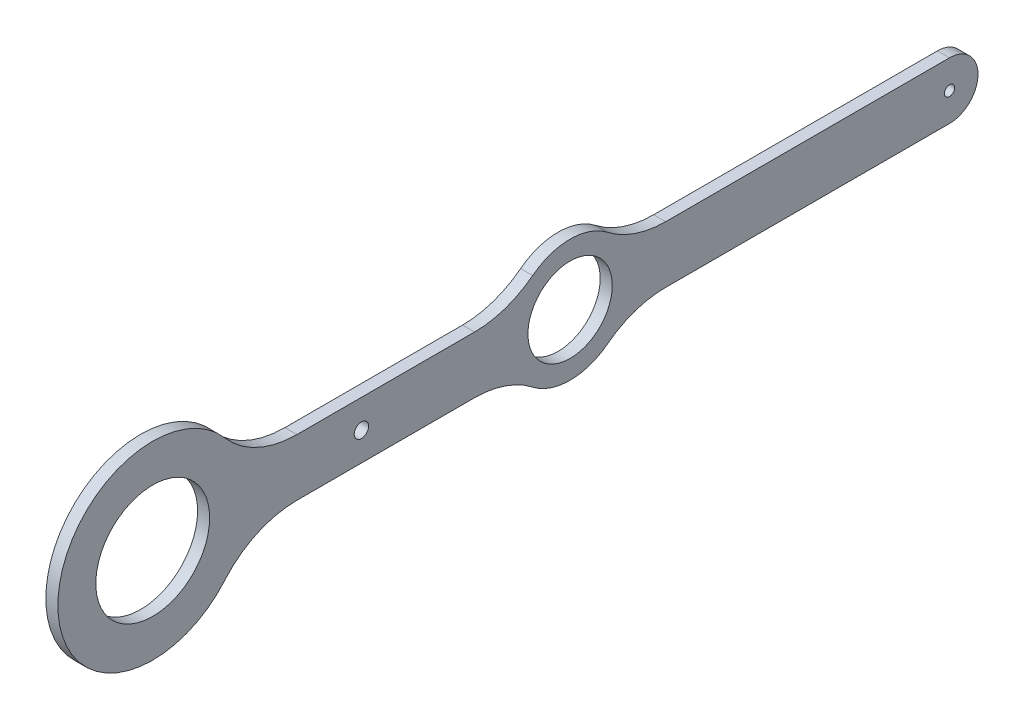
ISO-10303-21;
HEADER;
FILE_DESCRIPTION(('STEP AP214'),'2;1');
FILE_NAME('part.step','',(''),(''),'','','');
FILE_SCHEMA(('AUTOMOTIVE_DESIGN { 1 0 10303 214 1 1 1 1 }'));
ENDSEC;
DATA;
#1=APPLICATION_CONTEXT('core data for automotive mechanical design processes');
#2=APPLICATION_PROTOCOL_DEFINITION('international standard','automotive_design',2000,#1);
#3=PRODUCT_CONTEXT('',#1,'mechanical');
#4=PRODUCT('Part','Part','',(#3));
#5=PRODUCT_RELATED_PRODUCT_CATEGORY('part','',(#4));
#6=PRODUCT_DEFINITION_FORMATION('','',#4);
#7=PRODUCT_DEFINITION_CONTEXT('part definition',#1,'design');
#8=PRODUCT_DEFINITION('design','',#6,#7);
#9=PRODUCT_DEFINITION_SHAPE('','',#8);
#10=(LENGTH_UNIT() NAMED_UNIT(*) SI_UNIT(.MILLI.,.METRE.));
#11=(NAMED_UNIT(*) PLANE_ANGLE_UNIT() SI_UNIT($,.RADIAN.));
#12=(NAMED_UNIT(*) SI_UNIT($,.STERADIAN.) SOLID_ANGLE_UNIT());
#13=UNCERTAINTY_MEASURE_WITH_UNIT(LENGTH_MEASURE(1.E-05),#10,'distance_accuracy_value','');
#14=(GEOMETRIC_REPRESENTATION_CONTEXT(3) GLOBAL_UNCERTAINTY_ASSIGNED_CONTEXT((#13)) GLOBAL_UNIT_ASSIGNED_CONTEXT((#10,
#11,#12)) REPRESENTATION_CONTEXT('',''));
#15=CARTESIAN_POINT('',(0.,0.,0.));
#16=DIRECTION('',(0.,0.,1.));
#17=DIRECTION('',(1.,0.,0.));
#18=AXIS2_PLACEMENT_3D('',#15,#16,#17);
#19=CARTESIAN_POINT('',(3.175,0.,110.));
#20=DIRECTION('',(-1.,0.,0.));
#21=DIRECTION('',(0.,0.,1.));
#22=AXIS2_PLACEMENT_3D('',#19,#20,#21);
#23=CYLINDRICAL_SURFACE('',#22,25.);
#24=CARTESIAN_POINT('',(0.,0.,110.));
#25=DIRECTION('',(1.,0.,0.));
#26=DIRECTION('',(0.,0.,-1.));
#27=AXIS2_PLACEMENT_3D('',#24,#25,#26);
#28=CIRCLE('',#27,25.);
#29=CARTESIAN_POINT('',(0.,16.25,91.0016448080367));
#30=VERTEX_POINT('',#29);
#31=CARTESIAN_POINT('',(0.,-16.25,91.0016448080367));
#32=VERTEX_POINT('',#31);
#33=EDGE_CURVE('E200',#30,#32,#28,.T.);
#34=ORIENTED_EDGE('',*,*,#33,.T.);
#35=DIRECTION('',(-1.,0.,0.));
#36=VECTOR('',#35,1.);
#37=CARTESIAN_POINT('',(3.175,-16.25,91.0016448080367));
#38=LINE('',#37,#36);
#39=CARTESIAN_POINT('',(3.175,-16.25,91.0016448080367));
#40=VERTEX_POINT('',#39);
#41=EDGE_CURVE('E61',#32,#40,#38,.F.);
#42=ORIENTED_EDGE('',*,*,#41,.T.);
#43=CARTESIAN_POINT('',(3.175,0.,110.));
#44=DIRECTION('',(1.,0.,0.));
#45=DIRECTION('',(0.,0.,-1.));
#46=AXIS2_PLACEMENT_3D('',#43,#44,#45);
#47=CIRCLE('',#46,25.);
#48=CARTESIAN_POINT('',(3.175,16.25,91.0016448080367));
#49=VERTEX_POINT('',#48);
#50=EDGE_CURVE('E236',#49,#40,#47,.T.);
#51=ORIENTED_EDGE('',*,*,#50,.F.);
#52=DIRECTION('',(-1.,0.,0.));
#53=VECTOR('',#52,1.);
#54=CARTESIAN_POINT('',(3.175,16.25,91.0016448080367));
#55=LINE('',#54,#53);
#56=EDGE_CURVE('E272',#49,#30,#55,.T.);
#57=ORIENTED_EDGE('',*,*,#56,.T.);
#58=EDGE_LOOP('',(#34,#42,#51,#57));
#59=FACE_BOUND('',#58,.T.);
#60=ADVANCED_FACE('F45',(#59),#23,.T.);
#61=CARTESIAN_POINT('',(3.175,-7.5,0.));
#62=DIRECTION('',(0.,1.,0.));
#63=DIRECTION('',(0.,0.,1.));
#64=AXIS2_PLACEMENT_3D('',#61,#62,#63);
#65=PLANE('',#64);
#66=DIRECTION('',(0.,0.,-1.));
#67=VECTOR('',#66,1.);
#68=CARTESIAN_POINT('',(0.,-7.5,0.));
#69=LINE('',#68,#67);
#70=CARTESIAN_POINT('',(0.,-7.5,72.0032896160733));
#71=VERTEX_POINT('',#70);
#72=CARTESIAN_POINT('',(0.,-7.5,25.1791115063657));
#73=VERTEX_POINT('',#72);
#74=EDGE_CURVE('E203',#71,#73,#69,.T.);
#75=ORIENTED_EDGE('',*,*,#74,.T.);
#76=DIRECTION('',(1.,0.,0.));
#77=VECTOR('',#76,1.);
#78=CARTESIAN_POINT('',(3.175,-7.5,25.1791115063657));
#79=LINE('',#78,#77);
#80=CARTESIAN_POINT('',(3.175,-7.5,25.1791115063657));
#81=VERTEX_POINT('',#80);
#82=EDGE_CURVE('E269',#73,#81,#79,.T.);
#83=ORIENTED_EDGE('',*,*,#82,.T.);
#84=DIRECTION('',(0.,0.,-1.));
#85=VECTOR('',#84,1.);
#86=CARTESIAN_POINT('',(3.175,-7.5,0.));
#87=LINE('',#86,#85);
#88=CARTESIAN_POINT('',(3.175,-7.5,72.0032896160733));
#89=VERTEX_POINT('',#88);
#90=EDGE_CURVE('E320',#89,#81,#87,.T.);
#91=ORIENTED_EDGE('',*,*,#90,.F.);
#92=DIRECTION('',(1.,0.,0.));
#93=VECTOR('',#92,1.);
#94=CARTESIAN_POINT('',(0.,-7.5,72.0032896160733));
#95=LINE('',#94,#93);
#96=EDGE_CURVE('E265',#89,#71,#95,.F.);
#97=ORIENTED_EDGE('',*,*,#96,.T.);
#98=EDGE_LOOP('',(#75,#83,#91,#97));
#99=FACE_BOUND('',#98,.T.);
#100=ADVANCED_FACE('F363',(#99),#65,.F.);
#101=CARTESIAN_POINT('',(3.175,0.,0.));
#102=DIRECTION('',(-1.,0.,0.));
#103=DIRECTION('',(0.,0.,1.));
#104=AXIS2_PLACEMENT_3D('',#101,#102,#103);
#105=CYLINDRICAL_SURFACE('',#104,16.1125);
#106=CARTESIAN_POINT('',(0.,0.,0.));
#107=DIRECTION('',(1.,0.,0.));
#108=DIRECTION('',(0.,0.,-1.));
#109=AXIS2_PLACEMENT_3D('',#106,#107,#108);
#110=CIRCLE('',#109,16.1125);
#111=CARTESIAN_POINT('',(0.,-12.7371541501976,9.86800691143369));
#112=VERTEX_POINT('',#111);
#113=CARTESIAN_POINT('',(0.,-12.7371541501976,-9.8680069114337));
#114=VERTEX_POINT('',#113);
#115=EDGE_CURVE('E208',#112,#114,#110,.T.);
#116=ORIENTED_EDGE('',*,*,#115,.T.);
#117=DIRECTION('',(-1.,0.,0.));
#118=VECTOR('',#117,1.);
#119=CARTESIAN_POINT('',(3.175,-12.7371541501976,-9.8680069114337));
#120=LINE('',#119,#118);
#121=CARTESIAN_POINT('',(3.175,-12.7371541501976,-9.8680069114337));
#122=VERTEX_POINT('',#121);
#123=EDGE_CURVE('E262',#114,#122,#120,.F.);
#124=ORIENTED_EDGE('',*,*,#123,.T.);
#125=CARTESIAN_POINT('',(3.175,0.,0.));
#126=DIRECTION('',(1.,0.,0.));
#127=DIRECTION('',(0.,0.,-1.));
#128=AXIS2_PLACEMENT_3D('',#125,#126,#127);
#129=CIRCLE('',#128,16.1125);
#130=CARTESIAN_POINT('',(3.175,-12.7371541501976,9.86800691143369));
#131=VERTEX_POINT('',#130);
#132=EDGE_CURVE('E160',#131,#122,#129,.T.);
#133=ORIENTED_EDGE('',*,*,#132,.F.);
#134=DIRECTION('',(-1.,0.,0.));
#135=VECTOR('',#134,1.);
#136=CARTESIAN_POINT('',(3.175,-12.7371541501976,9.86800691143369));
#137=LINE('',#136,#135);
#138=EDGE_CURVE('E258',#131,#112,#137,.T.);
#139=ORIENTED_EDGE('',*,*,#138,.T.);
#140=EDGE_LOOP('',(#116,#124,#133,#139));
#141=FACE_BOUND('',#140,.T.);
#142=ADVANCED_FACE('F368',(#141),#105,.T.);
#143=CARTESIAN_POINT('',(3.175,-7.50000000000001,0.));
#144=DIRECTION('',(0.,1.,0.));
#145=DIRECTION('',(0.,0.,1.));
#146=AXIS2_PLACEMENT_3D('',#143,#144,#145);
#147=PLANE('',#146);
#148=DIRECTION('',(0.,0.,-1.));
#149=VECTOR('',#148,1.);
#150=CARTESIAN_POINT('',(3.175,-7.50000000000001,0.));
#151=LINE('',#150,#149);
#152=CARTESIAN_POINT('',(3.175,-7.5,-25.1791115063657));
#153=VERTEX_POINT('',#152);
#154=CARTESIAN_POINT('',(3.175,-7.49999999999996,-100.));
#155=VERTEX_POINT('',#154);
#156=EDGE_CURVE('E146',#153,#155,#151,.T.);
#157=ORIENTED_EDGE('',*,*,#156,.F.);
#158=DIRECTION('',(1.,0.,0.));
#159=VECTOR('',#158,1.);
#160=CARTESIAN_POINT('',(0.,-7.5,-25.1791115063657));
#161=LINE('',#160,#159);
#162=CARTESIAN_POINT('',(0.,-7.5,-25.1791115063657));
#163=VERTEX_POINT('',#162);
#164=EDGE_CURVE('E255',#153,#163,#161,.F.);
#165=ORIENTED_EDGE('',*,*,#164,.T.);
#166=DIRECTION('',(0.,0.,-1.));
#167=VECTOR('',#166,1.);
#168=CARTESIAN_POINT('',(0.,-7.50000000000001,0.));
#169=LINE('',#168,#167);
#170=CARTESIAN_POINT('',(0.,-7.49999999999996,-100.));
#171=VERTEX_POINT('',#170);
#172=EDGE_CURVE('E166',#163,#171,#169,.T.);
#173=ORIENTED_EDGE('',*,*,#172,.T.);
#174=DIRECTION('',(-1.,0.,0.));
#175=VECTOR('',#174,1.);
#176=CARTESIAN_POINT('',(3.175,-7.49999999999996,-100.));
#177=LINE('',#176,#175);
#178=EDGE_CURVE('E163',#155,#171,#177,.T.);
#179=ORIENTED_EDGE('',*,*,#178,.F.);
#180=EDGE_LOOP('',(#157,#165,#173,#179));
#181=FACE_BOUND('',#180,.T.);
#182=ADVANCED_FACE('F164',(#181),#147,.F.);
#183=CARTESIAN_POINT('',(3.175,0.,-100.));
#184=DIRECTION('',(-1.,0.,0.));
#185=DIRECTION('',(0.,0.,1.));
#186=AXIS2_PLACEMENT_3D('',#183,#184,#185);
#187=CYLINDRICAL_SURFACE('',#186,7.5);
#188=CARTESIAN_POINT('',(0.,0.,-100.));
#189=DIRECTION('',(1.,0.,0.));
#190=DIRECTION('',(0.,0.,-1.));
#191=AXIS2_PLACEMENT_3D('',#188,#189,#190);
#192=CIRCLE('',#191,7.5);
#193=CARTESIAN_POINT('',(0.,7.50000000000004,-100.));
#194=VERTEX_POINT('',#193);
#195=EDGE_CURVE('E214',#194,#171,#192,.F.);
#196=ORIENTED_EDGE('',*,*,#195,.F.);
#197=DIRECTION('',(-1.,0.,0.));
#198=VECTOR('',#197,1.);
#199=CARTESIAN_POINT('',(3.175,7.50000000000004,-100.));
#200=LINE('',#199,#198);
#201=CARTESIAN_POINT('',(3.175,7.50000000000004,-100.));
#202=VERTEX_POINT('',#201);
#203=EDGE_CURVE('E172',#202,#194,#200,.T.);
#204=ORIENTED_EDGE('',*,*,#203,.F.);
#205=CARTESIAN_POINT('',(3.175,0.,-100.));
#206=DIRECTION('',(1.,0.,0.));
#207=DIRECTION('',(0.,0.,-1.));
#208=AXIS2_PLACEMENT_3D('',#205,#206,#207);
#209=CIRCLE('',#208,7.5);
#210=EDGE_CURVE('E152',#202,#155,#209,.F.);
#211=ORIENTED_EDGE('',*,*,#210,.T.);
#212=ORIENTED_EDGE('',*,*,#178,.T.);
#213=EDGE_LOOP('',(#196,#204,#211,#212));
#214=FACE_BOUND('',#213,.T.);
#215=ADVANCED_FACE('F175',(#214),#187,.T.);
#216=CARTESIAN_POINT('',(3.175,7.49999999999999,0.));
#217=DIRECTION('',(0.,1.,0.));
#218=DIRECTION('',(0.,0.,1.));
#219=AXIS2_PLACEMENT_3D('',#216,#217,#218);
#220=PLANE('',#219);
#221=DIRECTION('',(0.,0.,-1.));
#222=VECTOR('',#221,1.);
#223=CARTESIAN_POINT('',(0.,7.49999999999999,0.));
#224=LINE('',#223,#222);
#225=CARTESIAN_POINT('',(0.,7.5,-25.1791115063658));
#226=VERTEX_POINT('',#225);
#227=EDGE_CURVE('E217',#226,#194,#224,.T.);
#228=ORIENTED_EDGE('',*,*,#227,.F.);
#229=DIRECTION('',(-1.,0.,0.));
#230=VECTOR('',#229,1.);
#231=CARTESIAN_POINT('',(3.175,7.5,-25.1791115063658));
#232=LINE('',#231,#230);
#233=CARTESIAN_POINT('',(3.175,7.5,-25.1791115063658));
#234=VERTEX_POINT('',#233);
#235=EDGE_CURVE('E245',#226,#234,#232,.F.);
#236=ORIENTED_EDGE('',*,*,#235,.T.);
#237=DIRECTION('',(0.,0.,-1.));
#238=VECTOR('',#237,1.);
#239=CARTESIAN_POINT('',(3.175,7.49999999999999,0.));
#240=LINE('',#239,#238);
#241=EDGE_CURVE('E178',#234,#202,#240,.T.);
#242=ORIENTED_EDGE('',*,*,#241,.T.);
#243=ORIENTED_EDGE('',*,*,#203,.T.);
#244=EDGE_LOOP('',(#228,#236,#242,#243));
#245=FACE_BOUND('',#244,.T.);
#246=ADVANCED_FACE('F340',(#245),#220,.T.);
#247=CARTESIAN_POINT('',(3.175,0.,0.));
#248=DIRECTION('',(-1.,0.,0.));
#249=DIRECTION('',(0.,0.,1.));
#250=AXIS2_PLACEMENT_3D('',#247,#248,#249);
#251=CYLINDRICAL_SURFACE('',#250,16.1125);
#252=CARTESIAN_POINT('',(3.175,0.,0.));
#253=DIRECTION('',(1.,0.,0.));
#254=DIRECTION('',(0.,0.,-1.));
#255=AXIS2_PLACEMENT_3D('',#252,#253,#254);
#256=CIRCLE('',#255,16.1125);
#257=CARTESIAN_POINT('',(3.175,12.7371541501976,-9.8680069114337));
#258=VERTEX_POINT('',#257);
#259=CARTESIAN_POINT('',(3.175,12.7371541501976,9.8680069114337));
#260=VERTEX_POINT('',#259);
#261=EDGE_CURVE('E181',#258,#260,#256,.T.);
#262=ORIENTED_EDGE('',*,*,#261,.F.);
#263=DIRECTION('',(-1.,0.,0.));
#264=VECTOR('',#263,1.);
#265=CARTESIAN_POINT('',(3.175,12.7371541501976,-9.86800691143369));
#266=LINE('',#265,#264);
#267=CARTESIAN_POINT('',(0.,12.7371541501976,-9.8680069114337));
#268=VERTEX_POINT('',#267);
#269=EDGE_CURVE('E241',#258,#268,#266,.T.);
#270=ORIENTED_EDGE('',*,*,#269,.T.);
#271=CARTESIAN_POINT('',(0.,0.,0.));
#272=DIRECTION('',(1.,0.,0.));
#273=DIRECTION('',(0.,0.,-1.));
#274=AXIS2_PLACEMENT_3D('',#271,#272,#273);
#275=CIRCLE('',#274,16.1125);
#276=CARTESIAN_POINT('',(0.,12.7371541501976,9.8680069114337));
#277=VERTEX_POINT('',#276);
#278=EDGE_CURVE('E220',#268,#277,#275,.T.);
#279=ORIENTED_EDGE('',*,*,#278,.T.);
#280=DIRECTION('',(-1.,0.,0.));
#281=VECTOR('',#280,1.);
#282=CARTESIAN_POINT('',(3.175,12.7371541501976,9.8680069114337));
#283=LINE('',#282,#281);
#284=EDGE_CURVE('E171',#277,#260,#283,.F.);
#285=ORIENTED_EDGE('',*,*,#284,.T.);
#286=EDGE_LOOP('',(#262,#270,#279,#285));
#287=FACE_BOUND('',#286,.T.);
#288=ADVANCED_FACE('F347',(#287),#251,.T.);
#289=CARTESIAN_POINT('',(3.175,0.,0.));
#290=DIRECTION('',(-1.,0.,0.));
#291=DIRECTION('',(0.,0.,1.));
#292=AXIS2_PLACEMENT_3D('',#289,#290,#291);
#293=CYLINDRICAL_SURFACE('',#292,11.1125);
#294=CARTESIAN_POINT('',(3.175,0.,0.));
#295=DIRECTION('',(1.,0.,0.));
#296=DIRECTION('',(0.,0.,-1.));
#297=AXIS2_PLACEMENT_3D('',#294,#295,#296);
#298=CIRCLE('',#297,11.1125);
#299=CARTESIAN_POINT('',(3.175,0.,-11.1125));
#300=VERTEX_POINT('',#299);
#301=EDGE_CURVE('E192',#300,#300,#298,.T.);
#302=ORIENTED_EDGE('',*,*,#301,.T.);
#303=EDGE_LOOP('',(#302));
#304=FACE_BOUND('',#303,.T.);
#305=CARTESIAN_POINT('',(0.,0.,0.));
#306=DIRECTION('',(1.,0.,0.));
#307=DIRECTION('',(0.,0.,-1.));
#308=AXIS2_PLACEMENT_3D('',#305,#306,#307);
#309=CIRCLE('',#308,11.1125);
#310=CARTESIAN_POINT('',(0.,0.,-11.1125));
#311=VERTEX_POINT('',#310);
#312=EDGE_CURVE('E228',#311,#311,#309,.T.);
#313=ORIENTED_EDGE('',*,*,#312,.F.);
#314=EDGE_LOOP('',(#313));
#315=FACE_BOUND('',#314,.T.);
#316=ADVANCED_FACE('F382',(#304,#315),#293,.F.);
#317=CARTESIAN_POINT('',(3.175,7.5,0.));
#318=DIRECTION('',(0.,1.,0.));
#319=DIRECTION('',(0.,0.,1.));
#320=AXIS2_PLACEMENT_3D('',#317,#318,#319);
#321=PLANE('',#320);
#322=DIRECTION('',(0.,0.,-1.));
#323=VECTOR('',#322,1.);
#324=CARTESIAN_POINT('',(3.175,7.5,0.));
#325=LINE('',#324,#323);
#326=CARTESIAN_POINT('',(3.175,7.5,72.0032896160733));
#327=VERTEX_POINT('',#326);
#328=CARTESIAN_POINT('',(3.175,7.5,25.1791115063657));
#329=VERTEX_POINT('',#328);
#330=EDGE_CURVE('E188',#327,#329,#325,.T.);
#331=ORIENTED_EDGE('',*,*,#330,.T.);
#332=DIRECTION('',(-1.,0.,0.));
#333=VECTOR('',#332,1.);
#334=CARTESIAN_POINT('',(3.175,7.5,25.1791115063657));
#335=LINE('',#334,#333);
#336=CARTESIAN_POINT('',(0.,7.5,25.1791115063657));
#337=VERTEX_POINT('',#336);
#338=EDGE_CURVE('E251',#329,#337,#335,.T.);
#339=ORIENTED_EDGE('',*,*,#338,.T.);
#340=DIRECTION('',(0.,0.,-1.));
#341=VECTOR('',#340,1.);
#342=CARTESIAN_POINT('',(0.,7.5,0.));
#343=LINE('',#342,#341);
#344=CARTESIAN_POINT('',(0.,7.5,72.0032896160733));
#345=VERTEX_POINT('',#344);
#346=EDGE_CURVE('E224',#345,#337,#343,.T.);
#347=ORIENTED_EDGE('',*,*,#346,.F.);
#348=DIRECTION('',(-1.,0.,0.));
#349=VECTOR('',#348,1.);
#350=CARTESIAN_POINT('',(3.175,7.5,72.0032896160733));
#351=LINE('',#350,#349);
#352=EDGE_CURVE('E248',#345,#327,#351,.F.);
#353=ORIENTED_EDGE('',*,*,#352,.T.);
#354=EDGE_LOOP('',(#331,#339,#347,#353));
#355=FACE_BOUND('',#354,.T.);
#356=ADVANCED_FACE('F316',(#355),#321,.T.);
#357=CARTESIAN_POINT('',(3.175,0.,110.));
#358=DIRECTION('',(-1.,0.,0.));
#359=DIRECTION('',(0.,0.,1.));
#360=AXIS2_PLACEMENT_3D('',#357,#358,#359);
#361=CYLINDRICAL_SURFACE('',#360,15.);
#362=CARTESIAN_POINT('',(3.175,0.,110.));
#363=DIRECTION('',(1.,0.,0.));
#364=DIRECTION('',(0.,0.,-1.));
#365=AXIS2_PLACEMENT_3D('',#362,#363,#364);
#366=CIRCLE('',#365,15.);
#367=CARTESIAN_POINT('',(3.175,0.,95.));
#368=VERTEX_POINT('',#367);
#369=EDGE_CURVE('E196',#368,#368,#366,.T.);
#370=ORIENTED_EDGE('',*,*,#369,.T.);
#371=EDGE_LOOP('',(#370));
#372=FACE_BOUND('',#371,.T.);
#373=CARTESIAN_POINT('',(0.,0.,110.));
#374=DIRECTION('',(1.,0.,0.));
#375=DIRECTION('',(0.,0.,-1.));
#376=AXIS2_PLACEMENT_3D('',#373,#374,#375);
#377=CIRCLE('',#376,15.);
#378=CARTESIAN_POINT('',(0.,0.,95.));
#379=VERTEX_POINT('',#378);
#380=EDGE_CURVE('E232',#379,#379,#377,.T.);
#381=ORIENTED_EDGE('',*,*,#380,.F.);
#382=EDGE_LOOP('',(#381));
#383=FACE_BOUND('',#382,.T.);
#384=ADVANCED_FACE('F385',(#372,#383),#361,.F.);
#385=CARTESIAN_POINT('',(3.175,0.,0.));
#386=DIRECTION('',(1.,0.,0.));
#387=DIRECTION('',(0.,0.,-1.));
#388=AXIS2_PLACEMENT_3D('',#385,#386,#387);
#389=PLANE('',#388);
#390=CARTESIAN_POINT('',(3.175,0.,-100.));
#391=DIRECTION('',(1.,0.,0.));
#392=DIRECTION('',(0.,0.,-1.));
#393=AXIS2_PLACEMENT_3D('',#390,#391,#392);
#394=CIRCLE('',#393,1.35254999999999);
#395=CARTESIAN_POINT('',(3.175,0.,-101.35255));
#396=VERTEX_POINT('',#395);
#397=EDGE_CURVE('E412',#396,#396,#394,.T.);
#398=ORIENTED_EDGE('',*,*,#397,.F.);
#399=EDGE_LOOP('',(#398));
#400=FACE_BOUND('',#399,.T.);
#401=CARTESIAN_POINT('',(3.175,0.,55.));
#402=DIRECTION('',(1.,0.,0.));
#403=DIRECTION('',(0.,0.,-1.));
#404=AXIS2_PLACEMENT_3D('',#401,#402,#403);
#405=CIRCLE('',#404,1.89864999999999);
#406=CARTESIAN_POINT('',(3.175,0.,53.10135));
#407=VERTEX_POINT('',#406);
#408=EDGE_CURVE('E416',#407,#407,#405,.T.);
#409=ORIENTED_EDGE('',*,*,#408,.F.);
#410=EDGE_LOOP('',(#409));
#411=FACE_BOUND('',#410,.T.);
#412=ORIENTED_EDGE('',*,*,#330,.F.);
#413=CARTESIAN_POINT('',(3.175,32.5,72.0032896160733));
#414=DIRECTION('',(1.,0.,0.));
#415=DIRECTION('',(0.,0.,-1.));
#416=AXIS2_PLACEMENT_3D('',#413,#414,#415);
#417=CIRCLE('',#416,25.);
#418=EDGE_CURVE('E11',#327,#49,#417,.F.);
#419=ORIENTED_EDGE('',*,*,#418,.T.);
#420=ORIENTED_EDGE('',*,*,#50,.T.);
#421=CARTESIAN_POINT('',(3.175,-32.5,72.0032896160733));
#422=DIRECTION('',(1.,0.,0.));
#423=DIRECTION('',(0.,0.,-1.));
#424=AXIS2_PLACEMENT_3D('',#421,#422,#423);
#425=CIRCLE('',#424,25.);
#426=EDGE_CURVE('E304',#40,#89,#425,.F.);
#427=ORIENTED_EDGE('',*,*,#426,.T.);
#428=ORIENTED_EDGE('',*,*,#90,.T.);
#429=CARTESIAN_POINT('',(3.175,-32.5,25.1791115063657));
#430=DIRECTION('',(1.,0.,0.));
#431=DIRECTION('',(0.,0.,-1.));
#432=AXIS2_PLACEMENT_3D('',#429,#430,#431);
#433=CIRCLE('',#432,25.);
#434=EDGE_CURVE('E298',#81,#131,#433,.F.);
#435=ORIENTED_EDGE('',*,*,#434,.T.);
#436=ORIENTED_EDGE('',*,*,#132,.T.);
#437=CARTESIAN_POINT('',(3.175,-32.5,-25.1791115063657));
#438=DIRECTION('',(1.,0.,0.));
#439=DIRECTION('',(0.,0.,-1.));
#440=AXIS2_PLACEMENT_3D('',#437,#438,#439);
#441=CIRCLE('',#440,25.);
#442=EDGE_CURVE('E155',#122,#153,#441,.F.);
#443=ORIENTED_EDGE('',*,*,#442,.T.);
#444=ORIENTED_EDGE('',*,*,#156,.T.);
#445=ORIENTED_EDGE('',*,*,#210,.F.);
#446=ORIENTED_EDGE('',*,*,#241,.F.);
#447=CARTESIAN_POINT('',(3.175,32.5,-25.1791115063657));
#448=DIRECTION('',(1.,0.,0.));
#449=DIRECTION('',(0.,0.,-1.));
#450=AXIS2_PLACEMENT_3D('',#447,#448,#449);
#451=CIRCLE('',#450,25.);
#452=EDGE_CURVE('E281',#234,#258,#451,.F.);
#453=ORIENTED_EDGE('',*,*,#452,.T.);
#454=ORIENTED_EDGE('',*,*,#261,.T.);
#455=CARTESIAN_POINT('',(3.175,32.5,25.1791115063657));
#456=DIRECTION('',(1.,0.,0.));
#457=DIRECTION('',(0.,0.,-1.));
#458=AXIS2_PLACEMENT_3D('',#455,#456,#457);
#459=CIRCLE('',#458,25.);
#460=EDGE_CURVE('E287',#260,#329,#459,.F.);
#461=ORIENTED_EDGE('',*,*,#460,.T.);
#462=EDGE_LOOP('',(#412,#419,#420,#427,#428,#435,#436,#443,#444,#445,#446,#453,#454,#461));
#463=FACE_BOUND('',#462,.T.);
#464=ORIENTED_EDGE('',*,*,#301,.F.);
#465=EDGE_LOOP('',(#464));
#466=FACE_BOUND('',#465,.T.);
#467=ORIENTED_EDGE('',*,*,#369,.F.);
#468=EDGE_LOOP('',(#467));
#469=FACE_BOUND('',#468,.T.);
#470=ADVANCED_FACE('F148',(#400,#411,#463,#466,#469),#389,.T.);
#471=CARTESIAN_POINT('',(0.,0.,0.));
#472=DIRECTION('',(1.,0.,0.));
#473=DIRECTION('',(0.,0.,-1.));
#474=AXIS2_PLACEMENT_3D('',#471,#472,#473);
#475=PLANE('',#474);
#476=CARTESIAN_POINT('',(0.,0.,-100.));
#477=DIRECTION('',(1.,0.,0.));
#478=DIRECTION('',(0.,0.,-1.));
#479=AXIS2_PLACEMENT_3D('',#476,#477,#478);
#480=CIRCLE('',#479,1.35254999999999);
#481=CARTESIAN_POINT('',(0.,0.,-101.35255));
#482=VERTEX_POINT('',#481);
#483=EDGE_CURVE('E409',#482,#482,#480,.T.);
#484=ORIENTED_EDGE('',*,*,#483,.T.);
#485=EDGE_LOOP('',(#484));
#486=FACE_BOUND('',#485,.T.);
#487=CARTESIAN_POINT('',(0.,0.,55.));
#488=DIRECTION('',(1.,0.,0.));
#489=DIRECTION('',(0.,0.,-1.));
#490=AXIS2_PLACEMENT_3D('',#487,#488,#489);
#491=CIRCLE('',#490,1.89864999999999);
#492=CARTESIAN_POINT('',(0.,0.,53.10135));
#493=VERTEX_POINT('',#492);
#494=EDGE_CURVE('E204',#493,#493,#491,.T.);
#495=ORIENTED_EDGE('',*,*,#494,.T.);
#496=EDGE_LOOP('',(#495));
#497=FACE_BOUND('',#496,.T.);
#498=ORIENTED_EDGE('',*,*,#33,.F.);
#499=CARTESIAN_POINT('',(0.,32.5,72.0032896160733));
#500=DIRECTION('',(1.,0.,0.));
#501=DIRECTION('',(0.,0.,-1.));
#502=AXIS2_PLACEMENT_3D('',#499,#500,#501);
#503=CIRCLE('',#502,25.);
#504=EDGE_CURVE('E54',#30,#345,#503,.T.);
#505=ORIENTED_EDGE('',*,*,#504,.T.);
#506=ORIENTED_EDGE('',*,*,#346,.T.);
#507=CARTESIAN_POINT('',(0.,32.5,25.1791115063657));
#508=DIRECTION('',(1.,0.,0.));
#509=DIRECTION('',(0.,0.,-1.));
#510=AXIS2_PLACEMENT_3D('',#507,#508,#509);
#511=CIRCLE('',#510,25.);
#512=EDGE_CURVE('E284',#337,#277,#511,.T.);
#513=ORIENTED_EDGE('',*,*,#512,.T.);
#514=ORIENTED_EDGE('',*,*,#278,.F.);
#515=CARTESIAN_POINT('',(0.,32.5,-25.1791115063657));
#516=DIRECTION('',(1.,0.,0.));
#517=DIRECTION('',(0.,0.,-1.));
#518=AXIS2_PLACEMENT_3D('',#515,#516,#517);
#519=CIRCLE('',#518,25.);
#520=EDGE_CURVE('E278',#268,#226,#519,.T.);
#521=ORIENTED_EDGE('',*,*,#520,.T.);
#522=ORIENTED_EDGE('',*,*,#227,.T.);
#523=ORIENTED_EDGE('',*,*,#195,.T.);
#524=ORIENTED_EDGE('',*,*,#172,.F.);
#525=CARTESIAN_POINT('',(0.,-32.5,-25.1791115063657));
#526=DIRECTION('',(1.,0.,0.));
#527=DIRECTION('',(0.,0.,-1.));
#528=AXIS2_PLACEMENT_3D('',#525,#526,#527);
#529=CIRCLE('',#528,25.);
#530=EDGE_CURVE('E290',#163,#114,#529,.T.);
#531=ORIENTED_EDGE('',*,*,#530,.T.);
#532=ORIENTED_EDGE('',*,*,#115,.F.);
#533=CARTESIAN_POINT('',(0.,-32.5,25.1791115063657));
#534=DIRECTION('',(1.,0.,0.));
#535=DIRECTION('',(0.,0.,-1.));
#536=AXIS2_PLACEMENT_3D('',#533,#534,#535);
#537=CIRCLE('',#536,25.);
#538=EDGE_CURVE('E295',#112,#73,#537,.T.);
#539=ORIENTED_EDGE('',*,*,#538,.T.);
#540=ORIENTED_EDGE('',*,*,#74,.F.);
#541=CARTESIAN_POINT('',(0.,-32.5,72.0032896160733));
#542=DIRECTION('',(1.,0.,0.));
#543=DIRECTION('',(0.,0.,-1.));
#544=AXIS2_PLACEMENT_3D('',#541,#542,#543);
#545=CIRCLE('',#544,25.);
#546=EDGE_CURVE('E301',#71,#32,#545,.T.);
#547=ORIENTED_EDGE('',*,*,#546,.T.);
#548=EDGE_LOOP('',(#498,#505,#506,#513,#514,#521,#522,#523,#524,#531,#532,#539,#540,#547));
#549=FACE_BOUND('',#548,.T.);
#550=ORIENTED_EDGE('',*,*,#312,.T.);
#551=EDGE_LOOP('',(#550));
#552=FACE_BOUND('',#551,.T.);
#553=ORIENTED_EDGE('',*,*,#380,.T.);
#554=EDGE_LOOP('',(#553));
#555=FACE_BOUND('',#554,.T.);
#556=ADVANCED_FACE('F310',(#486,#497,#549,#552,#555),#475,.F.);
#557=CARTESIAN_POINT('',(3.175,0.,55.));
#558=DIRECTION('',(1.,0.,0.));
#559=DIRECTION('',(0.,0.,-1.));
#560=AXIS2_PLACEMENT_3D('',#557,#558,#559);
#561=CYLINDRICAL_SURFACE('',#560,1.89864999999999);
#562=ORIENTED_EDGE('',*,*,#494,.F.);
#563=EDGE_LOOP('',(#562));
#564=FACE_BOUND('',#563,.T.);
#565=ORIENTED_EDGE('',*,*,#408,.T.);
#566=EDGE_LOOP('',(#565));
#567=FACE_BOUND('',#566,.T.);
#568=ADVANCED_FACE('F394',(#564,#567),#561,.F.);
#569=CARTESIAN_POINT('',(3.175,0.,-100.));
#570=DIRECTION('',(1.,0.,0.));
#571=DIRECTION('',(0.,0.,-1.));
#572=AXIS2_PLACEMENT_3D('',#569,#570,#571);
#573=CYLINDRICAL_SURFACE('',#572,1.35254999999999);
#574=ORIENTED_EDGE('',*,*,#483,.F.);
#575=EDGE_LOOP('',(#574));
#576=FACE_BOUND('',#575,.T.);
#577=ORIENTED_EDGE('',*,*,#397,.T.);
#578=EDGE_LOOP('',(#577));
#579=FACE_BOUND('',#578,.T.);
#580=ADVANCED_FACE('F360',(#576,#579),#573,.F.);
#581=CARTESIAN_POINT('',(3.175,32.5,-25.1791115063657));
#582=DIRECTION('',(-1.,0.,0.));
#583=DIRECTION('',(0.,0.,1.));
#584=AXIS2_PLACEMENT_3D('',#581,#582,#583);
#585=CYLINDRICAL_SURFACE('',#584,25.);
#586=ORIENTED_EDGE('',*,*,#452,.F.);
#587=ORIENTED_EDGE('',*,*,#235,.F.);
#588=ORIENTED_EDGE('',*,*,#520,.F.);
#589=ORIENTED_EDGE('',*,*,#269,.F.);
#590=EDGE_LOOP('',(#586,#587,#588,#589));
#591=FACE_BOUND('',#590,.T.);
#592=ADVANCED_FACE('F345',(#591),#585,.F.);
#593=CARTESIAN_POINT('',(3.175,32.5,25.1791115063657));
#594=DIRECTION('',(-1.,0.,0.));
#595=DIRECTION('',(0.,0.,1.));
#596=AXIS2_PLACEMENT_3D('',#593,#594,#595);
#597=CYLINDRICAL_SURFACE('',#596,25.);
#598=ORIENTED_EDGE('',*,*,#460,.F.);
#599=ORIENTED_EDGE('',*,*,#284,.F.);
#600=ORIENTED_EDGE('',*,*,#512,.F.);
#601=ORIENTED_EDGE('',*,*,#338,.F.);
#602=EDGE_LOOP('',(#598,#599,#600,#601));
#603=FACE_BOUND('',#602,.T.);
#604=ADVANCED_FACE('F351',(#603),#597,.F.);
#605=CARTESIAN_POINT('',(3.175,-32.5,-25.1791115063657));
#606=DIRECTION('',(-1.,0.,0.));
#607=DIRECTION('',(0.,0.,1.));
#608=AXIS2_PLACEMENT_3D('',#605,#606,#607);
#609=CYLINDRICAL_SURFACE('',#608,25.);
#610=ORIENTED_EDGE('',*,*,#442,.F.);
#611=ORIENTED_EDGE('',*,*,#123,.F.);
#612=ORIENTED_EDGE('',*,*,#530,.F.);
#613=ORIENTED_EDGE('',*,*,#164,.F.);
#614=EDGE_LOOP('',(#610,#611,#612,#613));
#615=FACE_BOUND('',#614,.T.);
#616=ADVANCED_FACE('F334',(#615),#609,.F.);
#617=CARTESIAN_POINT('',(3.175,-32.5,25.1791115063657));
#618=DIRECTION('',(-1.,0.,0.));
#619=DIRECTION('',(0.,0.,1.));
#620=AXIS2_PLACEMENT_3D('',#617,#618,#619);
#621=CYLINDRICAL_SURFACE('',#620,25.);
#622=ORIENTED_EDGE('',*,*,#434,.F.);
#623=ORIENTED_EDGE('',*,*,#82,.F.);
#624=ORIENTED_EDGE('',*,*,#538,.F.);
#625=ORIENTED_EDGE('',*,*,#138,.F.);
#626=EDGE_LOOP('',(#622,#623,#624,#625));
#627=FACE_BOUND('',#626,.T.);
#628=ADVANCED_FACE('F358',(#627),#621,.F.);
#629=CARTESIAN_POINT('',(3.175,-32.5,72.0032896160733));
#630=DIRECTION('',(-1.,0.,0.));
#631=DIRECTION('',(0.,0.,1.));
#632=AXIS2_PLACEMENT_3D('',#629,#630,#631);
#633=CYLINDRICAL_SURFACE('',#632,25.);
#634=ORIENTED_EDGE('',*,*,#426,.F.);
#635=ORIENTED_EDGE('',*,*,#41,.F.);
#636=ORIENTED_EDGE('',*,*,#546,.F.);
#637=ORIENTED_EDGE('',*,*,#96,.F.);
#638=EDGE_LOOP('',(#634,#635,#636,#637));
#639=FACE_BOUND('',#638,.T.);
#640=ADVANCED_FACE('F458',(#639),#633,.F.);
#641=CARTESIAN_POINT('',(3.175,32.5,72.0032896160733));
#642=DIRECTION('',(-1.,0.,0.));
#643=DIRECTION('',(0.,0.,1.));
#644=AXIS2_PLACEMENT_3D('',#641,#642,#643);
#645=CYLINDRICAL_SURFACE('',#644,25.);
#646=ORIENTED_EDGE('',*,*,#418,.F.);
#647=ORIENTED_EDGE('',*,*,#352,.F.);
#648=ORIENTED_EDGE('',*,*,#504,.F.);
#649=ORIENTED_EDGE('',*,*,#56,.F.);
#650=EDGE_LOOP('',(#646,#647,#648,#649));
#651=FACE_BOUND('',#650,.T.);
#652=ADVANCED_FACE('F47',(#651),#645,.F.);
#653=CLOSED_SHELL('',(#60,#100,#142,#182,#215,#246,#288,#316,#356,#384,#470,#556,#568,#580,#592,
#604,#616,#628,#640,#652));
#654=MANIFOLD_SOLID_BREP('B2',#653);
#655=ADVANCED_BREP_SHAPE_REPRESENTATION('',(#18,#654),#14);
#656=SHAPE_DEFINITION_REPRESENTATION(#9,#655);
ENDSEC;
END-ISO-10303-21;
